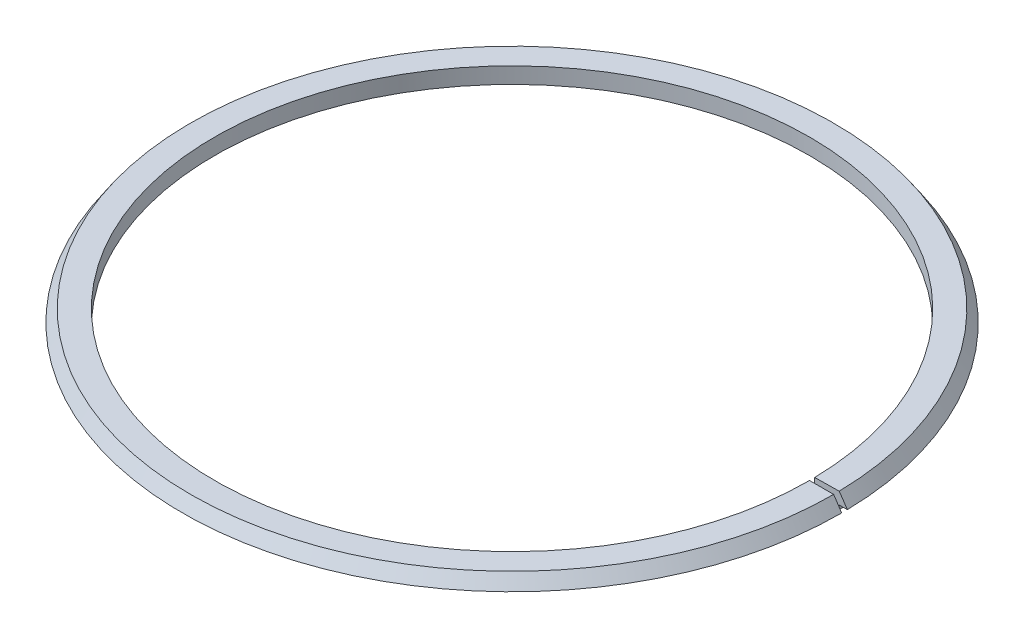
ISO-10303-21;
HEADER;
FILE_DESCRIPTION(('STEP AP214'),'2;1');
FILE_NAME('part.step','',(''),(''),'','','');
FILE_SCHEMA(('AUTOMOTIVE_DESIGN { 1 0 10303 214 1 1 1 1 }'));
ENDSEC;
DATA;
#1=APPLICATION_CONTEXT('core data for automotive mechanical design processes');
#2=APPLICATION_PROTOCOL_DEFINITION('international standard','automotive_design',2000,#1);
#3=PRODUCT_CONTEXT('',#1,'mechanical');
#4=PRODUCT('Part','Part','',(#3));
#5=PRODUCT_RELATED_PRODUCT_CATEGORY('part','',(#4));
#6=PRODUCT_DEFINITION_FORMATION('','',#4);
#7=PRODUCT_DEFINITION_CONTEXT('part definition',#1,'design');
#8=PRODUCT_DEFINITION('design','',#6,#7);
#9=PRODUCT_DEFINITION_SHAPE('','',#8);
#10=(LENGTH_UNIT() NAMED_UNIT(*) SI_UNIT(.MILLI.,.METRE.));
#11=(NAMED_UNIT(*) PLANE_ANGLE_UNIT() SI_UNIT($,.RADIAN.));
#12=(NAMED_UNIT(*) SI_UNIT($,.STERADIAN.) SOLID_ANGLE_UNIT());
#13=UNCERTAINTY_MEASURE_WITH_UNIT(LENGTH_MEASURE(1.E-05),#10,'distance_accuracy_value','');
#14=(GEOMETRIC_REPRESENTATION_CONTEXT(3) GLOBAL_UNCERTAINTY_ASSIGNED_CONTEXT((#13)) GLOBAL_UNIT_ASSIGNED_CONTEXT((#10,
#11,#12)) REPRESENTATION_CONTEXT('',''));
#15=CARTESIAN_POINT('',(0.,0.,0.));
#16=DIRECTION('',(0.,0.,1.));
#17=DIRECTION('',(1.,0.,0.));
#18=AXIS2_PLACEMENT_3D('',#15,#16,#17);
#19=CARTESIAN_POINT('',(0.,9.14615305913649,0.));
#20=DIRECTION('',(0.,1.,0.));
#21=DIRECTION('',(0.,0.,1.));
#22=AXIS2_PLACEMENT_3D('',#19,#20,#21);
#23=CYLINDRICAL_SURFACE('',#22,40.);
#24=CARTESIAN_POINT('',(0.,0.5,0.));
#25=DIRECTION('',(0.,1.,0.));
#26=DIRECTION('',(0.,0.,1.));
#27=AXIS2_PLACEMENT_3D('',#24,#25,#26);
#28=CIRCLE('',#27,40.);
#29=CARTESIAN_POINT('',(39.9939078062557,0.5,-0.698096257490774));
#30=VERTEX_POINT('',#29);
#31=CARTESIAN_POINT('',(40.,0.5,0.));
#32=VERTEX_POINT('',#31);
#33=EDGE_CURVE('E11',#30,#32,#28,.T.);
#34=ORIENTED_EDGE('',*,*,#33,.F.);
#35=DIRECTION('',(0.,1.,0.));
#36=VECTOR('',#35,1.);
#37=CARTESIAN_POINT('',(39.9939078062557,0.5,-0.698096257490774));
#38=LINE('',#37,#36);
#39=CARTESIAN_POINT('',(39.9939078062557,0.,-0.698096257490774));
#40=VERTEX_POINT('',#39);
#41=EDGE_CURVE('E130',#40,#30,#38,.T.);
#42=ORIENTED_EDGE('',*,*,#41,.F.);
#43=CARTESIAN_POINT('',(0.,0.,0.));
#44=DIRECTION('',(0.,1.,0.));
#45=DIRECTION('',(0.,0.,1.));
#46=AXIS2_PLACEMENT_3D('',#43,#44,#45);
#47=CIRCLE('',#46,40.);
#48=CARTESIAN_POINT('',(40.,0.,0.));
#49=VERTEX_POINT('',#48);
#50=EDGE_CURVE('E57',#40,#49,#47,.T.);
#51=ORIENTED_EDGE('',*,*,#50,.T.);
#52=DIRECTION('',(0.,1.,0.));
#53=VECTOR('',#52,1.);
#54=CARTESIAN_POINT('',(40.,0.5,0.));
#55=LINE('',#54,#53);
#56=EDGE_CURVE('E105',#49,#32,#55,.T.);
#57=ORIENTED_EDGE('',*,*,#56,.T.);
#58=EDGE_LOOP('',(#34,#42,#51,#57));
#59=FACE_BOUND('',#58,.T.);
#60=ADVANCED_FACE('F41',(#59),#23,.T.);
#61=CARTESIAN_POINT('',(39.9939078062557,0.5,-0.698096257490774));
#62=DIRECTION('',(0.,1.,0.));
#63=DIRECTION('',(0.,0.,1.));
#64=AXIS2_PLACEMENT_3D('',#61,#62,#63);
#65=PLANE('',#64);
#66=CARTESIAN_POINT('',(0.,0.5,0.));
#67=DIRECTION('',(0.,1.,0.));
#68=DIRECTION('',(0.,0.,1.));
#69=AXIS2_PLACEMENT_3D('',#66,#67,#68);
#70=CIRCLE('',#69,41.);
#71=CARTESIAN_POINT('',(40.9937555014121,0.5,-0.715548663928043));
#72=VERTEX_POINT('',#71);
#73=CARTESIAN_POINT('',(41.,0.5,0.));
#74=VERTEX_POINT('',#73);
#75=EDGE_CURVE('E50',#72,#74,#70,.T.);
#76=ORIENTED_EDGE('',*,*,#75,.F.);
#77=DIRECTION('',(0.999847695156391,0.,-0.0174524064372693));
#78=VECTOR('',#77,1.);
#79=CARTESIAN_POINT('',(39.9939078062557,0.5,-0.698096257490774));
#80=LINE('',#79,#78);
#81=EDGE_CURVE('E101',#30,#72,#80,.T.);
#82=ORIENTED_EDGE('',*,*,#81,.F.);
#83=ORIENTED_EDGE('',*,*,#33,.T.);
#84=DIRECTION('',(1.,0.,0.));
#85=VECTOR('',#84,1.);
#86=CARTESIAN_POINT('',(40.,0.5,0.));
#87=LINE('',#86,#85);
#88=EDGE_CURVE('E98',#32,#74,#87,.T.);
#89=ORIENTED_EDGE('',*,*,#88,.T.);
#90=EDGE_LOOP('',(#76,#82,#83,#89));
#91=FACE_BOUND('',#90,.T.);
#92=ADVANCED_FACE('F43',(#91),#65,.F.);
#93=CARTESIAN_POINT('',(0.,0.5,0.));
#94=DIRECTION('',(0.,-1.,0.));
#95=DIRECTION('',(0.,0.,-1.));
#96=AXIS2_PLACEMENT_3D('',#93,#94,#95);
#97=CONICAL_SURFACE('',#96,41.,0.588002603547568);
#98=CARTESIAN_POINT('',(0.,2.,0.));
#99=DIRECTION('',(0.,1.,0.));
#100=DIRECTION('',(0.,0.,1.));
#101=AXIS2_PLACEMENT_3D('',#98,#99,#100);
#102=CIRCLE('',#101,40.);
#103=CARTESIAN_POINT('',(39.9939078062557,2.,-0.698096257490774));
#104=VERTEX_POINT('',#103);
#105=CARTESIAN_POINT('',(40.,2.,0.));
#106=VERTEX_POINT('',#105);
#107=EDGE_CURVE('E157',#104,#106,#102,.T.);
#108=ORIENTED_EDGE('',*,*,#107,.F.);
#109=DIRECTION('',(-0.554615712698594,0.832050294337843,0.00968085327535577));
#110=VECTOR('',#109,1.);
#111=CARTESIAN_POINT('',(39.9939078062557,2.,-0.698096257490774));
#112=LINE('',#111,#110);
#113=EDGE_CURVE('E135',#72,#104,#112,.T.);
#114=ORIENTED_EDGE('',*,*,#113,.F.);
#115=ORIENTED_EDGE('',*,*,#75,.T.);
#116=DIRECTION('',(-0.554700196225229,0.832050294337843,0.));
#117=VECTOR('',#116,1.);
#118=CARTESIAN_POINT('',(40.,2.,0.));
#119=LINE('',#118,#117);
#120=EDGE_CURVE('E113',#74,#106,#119,.T.);
#121=ORIENTED_EDGE('',*,*,#120,.T.);
#122=EDGE_LOOP('',(#108,#114,#115,#121));
#123=FACE_BOUND('',#122,.T.);
#124=ADVANCED_FACE('F163',(#123),#97,.T.);
#125=CARTESIAN_POINT('',(36.9943647207865,2.,-0.645739038178966));
#126=DIRECTION('',(0.,-1.,0.));
#127=DIRECTION('',(0.,0.,-1.));
#128=AXIS2_PLACEMENT_3D('',#125,#126,#127);
#129=PLANE('',#128);
#130=CARTESIAN_POINT('',(0.,2.,0.));
#131=DIRECTION('',(0.,1.,0.));
#132=DIRECTION('',(0.,0.,1.));
#133=AXIS2_PLACEMENT_3D('',#130,#131,#132);
#134=CIRCLE('',#133,37.);
#135=CARTESIAN_POINT('',(36.9943647207865,2.,-0.645739038178966));
#136=VERTEX_POINT('',#135);
#137=CARTESIAN_POINT('',(37.,2.,0.));
#138=VERTEX_POINT('',#137);
#139=EDGE_CURVE('E154',#136,#138,#134,.T.);
#140=ORIENTED_EDGE('',*,*,#139,.F.);
#141=DIRECTION('',(-0.999847695156391,0.,0.0174524064372693));
#142=VECTOR('',#141,1.);
#143=CARTESIAN_POINT('',(36.9943647207865,2.,-0.645739038178966));
#144=LINE('',#143,#142);
#145=EDGE_CURVE('E139',#104,#136,#144,.T.);
#146=ORIENTED_EDGE('',*,*,#145,.F.);
#147=ORIENTED_EDGE('',*,*,#107,.T.);
#148=DIRECTION('',(-1.,0.,0.));
#149=VECTOR('',#148,1.);
#150=CARTESIAN_POINT('',(37.,2.,0.));
#151=LINE('',#150,#149);
#152=EDGE_CURVE('E118',#106,#138,#151,.T.);
#153=ORIENTED_EDGE('',*,*,#152,.T.);
#154=EDGE_LOOP('',(#140,#146,#147,#153));
#155=FACE_BOUND('',#154,.T.);
#156=ADVANCED_FACE('F171',(#155),#129,.F.);
#157=CARTESIAN_POINT('',(0.,9.14615305913649,0.));
#158=DIRECTION('',(0.,1.,0.));
#159=DIRECTION('',(0.,0.,1.));
#160=AXIS2_PLACEMENT_3D('',#157,#158,#159);
#161=CYLINDRICAL_SURFACE('',#160,37.);
#162=CARTESIAN_POINT('',(0.,0.,0.));
#163=DIRECTION('',(0.,1.,0.));
#164=DIRECTION('',(0.,0.,1.));
#165=AXIS2_PLACEMENT_3D('',#162,#163,#164);
#166=CIRCLE('',#165,37.);
#167=CARTESIAN_POINT('',(36.9943647207865,0.,-0.645739038178966));
#168=VERTEX_POINT('',#167);
#169=CARTESIAN_POINT('',(37.,0.,0.));
#170=VERTEX_POINT('',#169);
#171=EDGE_CURVE('E65',#168,#170,#166,.T.);
#172=ORIENTED_EDGE('',*,*,#171,.F.);
#173=DIRECTION('',(0.,-1.,0.));
#174=VECTOR('',#173,1.);
#175=CARTESIAN_POINT('',(36.9943647207865,2.,-0.645739038178966));
#176=LINE('',#175,#174);
#177=EDGE_CURVE('E143',#136,#168,#176,.T.);
#178=ORIENTED_EDGE('',*,*,#177,.F.);
#179=ORIENTED_EDGE('',*,*,#139,.T.);
#180=DIRECTION('',(0.,-1.,0.));
#181=VECTOR('',#180,1.);
#182=CARTESIAN_POINT('',(37.,2.,0.));
#183=LINE('',#182,#181);
#184=EDGE_CURVE('E124',#138,#170,#183,.T.);
#185=ORIENTED_EDGE('',*,*,#184,.T.);
#186=EDGE_LOOP('',(#172,#178,#179,#185));
#187=FACE_BOUND('',#186,.T.);
#188=ADVANCED_FACE('F169',(#187),#161,.F.);
#189=CARTESIAN_POINT('',(36.9943647207865,0.,-0.645739038178966));
#190=DIRECTION('',(0.,1.,0.));
#191=DIRECTION('',(0.,0.,1.));
#192=AXIS2_PLACEMENT_3D('',#189,#190,#191);
#193=PLANE('',#192);
#194=DIRECTION('',(0.999847695156391,0.,-0.0174524064372693));
#195=VECTOR('',#194,1.);
#196=CARTESIAN_POINT('',(36.9943647207865,0.,-0.645739038178966));
#197=LINE('',#196,#195);
#198=EDGE_CURVE('E146',#168,#40,#197,.T.);
#199=ORIENTED_EDGE('',*,*,#198,.F.);
#200=ORIENTED_EDGE('',*,*,#171,.T.);
#201=DIRECTION('',(1.,0.,0.));
#202=VECTOR('',#201,1.);
#203=CARTESIAN_POINT('',(37.,0.,0.));
#204=LINE('',#203,#202);
#205=EDGE_CURVE('E127',#170,#49,#204,.T.);
#206=ORIENTED_EDGE('',*,*,#205,.T.);
#207=ORIENTED_EDGE('',*,*,#50,.F.);
#208=EDGE_LOOP('',(#199,#200,#206,#207));
#209=FACE_BOUND('',#208,.T.);
#210=ADVANCED_FACE('F167',(#209),#193,.F.);
#211=CARTESIAN_POINT('',(39.9939078062557,2.,-0.698096257490774));
#212=DIRECTION('',(0.0174524064372693,0.,0.999847695156391));
#213=DIRECTION('',(0.999847695156391,0.,-0.0174524064372693));
#214=AXIS2_PLACEMENT_3D('',#211,#212,#213);
#215=PLANE('',#214);
#216=ORIENTED_EDGE('',*,*,#41,.T.);
#217=ORIENTED_EDGE('',*,*,#81,.T.);
#218=ORIENTED_EDGE('',*,*,#113,.T.);
#219=ORIENTED_EDGE('',*,*,#145,.T.);
#220=ORIENTED_EDGE('',*,*,#177,.T.);
#221=ORIENTED_EDGE('',*,*,#198,.T.);
#222=EDGE_LOOP('',(#216,#217,#218,#219,#220,#221));
#223=FACE_BOUND('',#222,.T.);
#224=ADVANCED_FACE('F165',(#223),#215,.T.);
#225=CARTESIAN_POINT('',(40.,2.,0.));
#226=DIRECTION('',(0.,0.,1.));
#227=DIRECTION('',(1.,0.,0.));
#228=AXIS2_PLACEMENT_3D('',#225,#226,#227);
#229=PLANE('',#228);
#230=ORIENTED_EDGE('',*,*,#56,.F.);
#231=ORIENTED_EDGE('',*,*,#205,.F.);
#232=ORIENTED_EDGE('',*,*,#184,.F.);
#233=ORIENTED_EDGE('',*,*,#152,.F.);
#234=ORIENTED_EDGE('',*,*,#120,.F.);
#235=ORIENTED_EDGE('',*,*,#88,.F.);
#236=EDGE_LOOP('',(#230,#231,#232,#233,#234,#235));
#237=FACE_BOUND('',#236,.T.);
#238=ADVANCED_FACE('F110',(#237),#229,.F.);
#239=CLOSED_SHELL('',(#60,#92,#124,#156,#188,#210,#224,#238));
#240=MANIFOLD_SOLID_BREP('B2',#239);
#241=ADVANCED_BREP_SHAPE_REPRESENTATION('',(#18,#240),#14);
#242=SHAPE_DEFINITION_REPRESENTATION(#9,#241);
ENDSEC;
END-ISO-10303-21;
